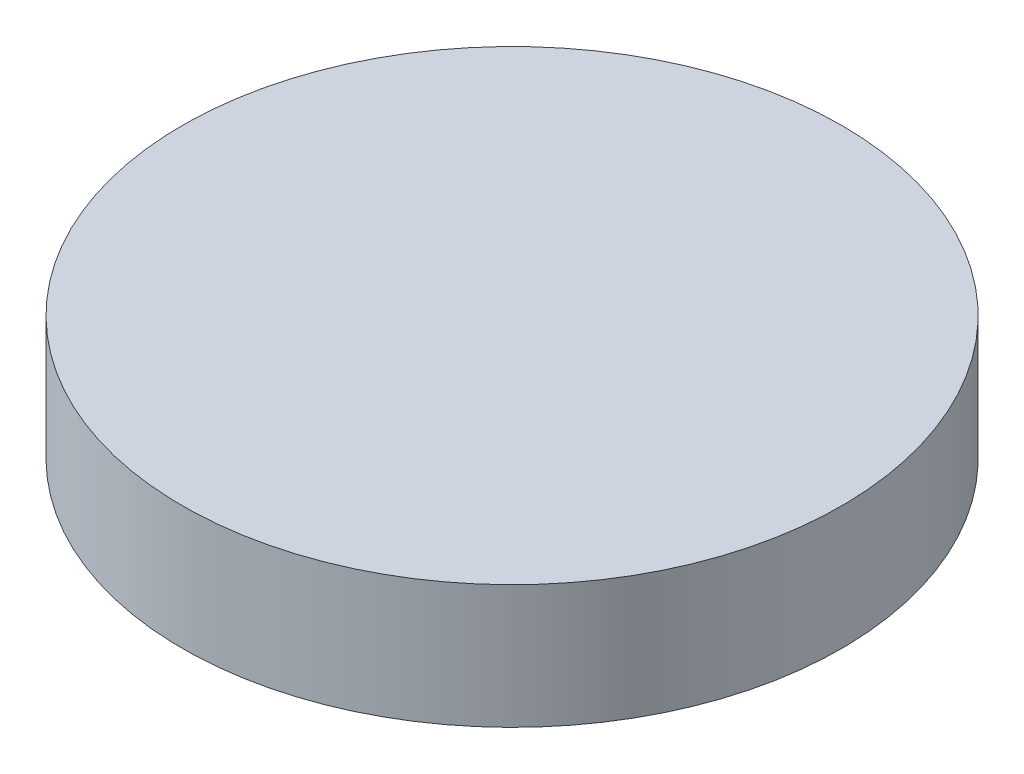
ISO-10303-21;
HEADER;
FILE_DESCRIPTION(('STEP AP214'),'2;1');
FILE_NAME('part.step','',(''),(''),'','','');
FILE_SCHEMA(('AUTOMOTIVE_DESIGN { 1 0 10303 214 1 1 1 1 }'));
ENDSEC;
DATA;
#1=APPLICATION_CONTEXT('core data for automotive mechanical design processes');
#2=APPLICATION_PROTOCOL_DEFINITION('international standard','automotive_design',2000,#1);
#3=PRODUCT_CONTEXT('',#1,'mechanical');
#4=PRODUCT('Part','Part','',(#3));
#5=PRODUCT_RELATED_PRODUCT_CATEGORY('part','',(#4));
#6=PRODUCT_DEFINITION_FORMATION('','',#4);
#7=PRODUCT_DEFINITION_CONTEXT('part definition',#1,'design');
#8=PRODUCT_DEFINITION('design','',#6,#7);
#9=PRODUCT_DEFINITION_SHAPE('','',#8);
#10=(LENGTH_UNIT() NAMED_UNIT(*) SI_UNIT(.MILLI.,.METRE.));
#11=(NAMED_UNIT(*) PLANE_ANGLE_UNIT() SI_UNIT($,.RADIAN.));
#12=(NAMED_UNIT(*) SI_UNIT($,.STERADIAN.) SOLID_ANGLE_UNIT());
#13=UNCERTAINTY_MEASURE_WITH_UNIT(LENGTH_MEASURE(1.E-05),#10,'distance_accuracy_value','');
#14=(GEOMETRIC_REPRESENTATION_CONTEXT(3) GLOBAL_UNCERTAINTY_ASSIGNED_CONTEXT((#13)) GLOBAL_UNIT_ASSIGNED_CONTEXT((#10,
#11,#12)) REPRESENTATION_CONTEXT('',''));
#15=CARTESIAN_POINT('',(0.,0.,0.));
#16=DIRECTION('',(0.,0.,1.));
#17=DIRECTION('',(1.,0.,0.));
#18=AXIS2_PLACEMENT_3D('',#15,#16,#17);
#19=CARTESIAN_POINT('',(0.,19.05,0.));
#20=DIRECTION('',(0.,-1.,0.));
#21=DIRECTION('',(0.,0.,-1.));
#22=AXIS2_PLACEMENT_3D('',#19,#20,#21);
#23=CYLINDRICAL_SURFACE('',#22,50.8);
#24=CARTESIAN_POINT('',(0.,19.05,0.));
#25=DIRECTION('',(0.,1.,0.));
#26=DIRECTION('',(0.,0.,1.));
#27=AXIS2_PLACEMENT_3D('',#24,#25,#26);
#28=CIRCLE('',#27,50.8);
#29=CARTESIAN_POINT('',(0.,19.05,-50.8));
#30=VERTEX_POINT('',#29);
#31=EDGE_CURVE('E10',#30,#30,#28,.T.);
#32=CARTESIAN_POINT('',(0.,0.,0.));
#33=DIRECTION('',(0.,1.,0.));
#34=DIRECTION('',(0.,0.,1.));
#35=AXIS2_PLACEMENT_3D('',#32,#33,#34);
#36=CIRCLE('',#35,50.8);
#37=CARTESIAN_POINT('',(0.,0.,-50.8));
#38=VERTEX_POINT('',#37);
#39=EDGE_CURVE('E40',#38,#38,#36,.T.);
#40=CARTESIAN_POINT('',(0.,19.05,-50.8));
#41=CARTESIAN_POINT('',(0.,18.8515625,-50.8));
#42=CARTESIAN_POINT('',(0.,18.653125,-50.8));
#43=CARTESIAN_POINT('',(0.,18.25625,-50.8));
#44=CARTESIAN_POINT('',(0.,18.0578125,-50.8));
#45=CARTESIAN_POINT('',(0.,17.6609375,-50.8));
#46=CARTESIAN_POINT('',(0.,17.4625,-50.8));
#47=CARTESIAN_POINT('',(0.,17.065625,-50.8));
#48=CARTESIAN_POINT('',(0.,16.8671875,-50.8));
#49=CARTESIAN_POINT('',(0.,16.4703125,-50.8));
#50=CARTESIAN_POINT('',(0.,16.271875,-50.8));
#51=CARTESIAN_POINT('',(0.,15.875,-50.8));
#52=CARTESIAN_POINT('',(0.,15.6765625,-50.8));
#53=CARTESIAN_POINT('',(0.,15.2796875,-50.8));
#54=CARTESIAN_POINT('',(0.,15.08125,-50.8));
#55=CARTESIAN_POINT('',(0.,14.684375,-50.8));
#56=CARTESIAN_POINT('',(0.,14.4859375,-50.8));
#57=CARTESIAN_POINT('',(0.,14.0890625,-50.8));
#58=CARTESIAN_POINT('',(0.,13.890625,-50.8));
#59=CARTESIAN_POINT('',(0.,13.49375,-50.8));
#60=CARTESIAN_POINT('',(0.,13.2953125,-50.8));
#61=CARTESIAN_POINT('',(0.,12.8984375,-50.8));
#62=CARTESIAN_POINT('',(0.,12.7,-50.8));
#63=CARTESIAN_POINT('',(0.,12.303125,-50.8));
#64=CARTESIAN_POINT('',(0.,12.1046875,-50.8));
#65=CARTESIAN_POINT('',(0.,11.7078125,-50.8));
#66=CARTESIAN_POINT('',(0.,11.509375,-50.8));
#67=CARTESIAN_POINT('',(0.,11.1125,-50.8));
#68=CARTESIAN_POINT('',(0.,10.9140625,-50.8));
#69=CARTESIAN_POINT('',(0.,10.5171875,-50.8));
#70=CARTESIAN_POINT('',(0.,10.31875,-50.8));
#71=CARTESIAN_POINT('',(0.,9.921875,-50.8));
#72=CARTESIAN_POINT('',(0.,9.7234375,-50.8));
#73=CARTESIAN_POINT('',(0.,9.3265625,-50.8));
#74=CARTESIAN_POINT('',(0.,9.128125,-50.8));
#75=CARTESIAN_POINT('',(0.,8.73125,-50.8));
#76=CARTESIAN_POINT('',(0.,8.5328125,-50.8));
#77=CARTESIAN_POINT('',(0.,8.1359375,-50.8));
#78=CARTESIAN_POINT('',(0.,7.9375,-50.8));
#79=CARTESIAN_POINT('',(0.,7.540625,-50.8));
#80=CARTESIAN_POINT('',(0.,7.3421875,-50.8));
#81=CARTESIAN_POINT('',(0.,6.9453125,-50.8));
#82=CARTESIAN_POINT('',(0.,6.746875,-50.8));
#83=CARTESIAN_POINT('',(0.,6.35,-50.8));
#84=CARTESIAN_POINT('',(0.,6.1515625,-50.8));
#85=CARTESIAN_POINT('',(0.,5.7546875,-50.8));
#86=CARTESIAN_POINT('',(0.,5.55625,-50.8));
#87=CARTESIAN_POINT('',(0.,5.159375,-50.8));
#88=CARTESIAN_POINT('',(0.,4.9609375,-50.8));
#89=CARTESIAN_POINT('',(0.,4.5640625,-50.8));
#90=CARTESIAN_POINT('',(0.,4.365625,-50.8));
#91=CARTESIAN_POINT('',(0.,3.96875,-50.8));
#92=CARTESIAN_POINT('',(0.,3.7703125,-50.8));
#93=CARTESIAN_POINT('',(0.,3.3734375,-50.8));
#94=CARTESIAN_POINT('',(0.,3.175,-50.8));
#95=CARTESIAN_POINT('',(0.,2.778125,-50.8));
#96=CARTESIAN_POINT('',(0.,2.5796875,-50.8));
#97=CARTESIAN_POINT('',(0.,2.1828125,-50.8));
#98=CARTESIAN_POINT('',(0.,1.984375,-50.8));
#99=CARTESIAN_POINT('',(0.,1.5875,-50.8));
#100=CARTESIAN_POINT('',(0.,1.3890625,-50.8));
#101=CARTESIAN_POINT('',(0.,0.992187500000001,-50.8));
#102=CARTESIAN_POINT('',(0.,0.793750000000001,-50.8));
#103=CARTESIAN_POINT('',(0.,0.396875,-50.8));
#104=CARTESIAN_POINT('',(0.,0.1984375,-50.8));
#105=CARTESIAN_POINT('',(0.,0.,-50.8));
#106=B_SPLINE_CURVE_WITH_KNOTS('',3,(#40,#41,#42,#43,#44,#45,#46,#47,#48,#49,#50,#51,#52,#53,
#54,#55,#56,#57,#58,#59,#60,#61,#62,#63,#64,#65,#66,#67,#68,#69,#70,#71,#72,#73,#74,#75,#76,#77,
#78,#79,#80,#81,#82,#83,#84,#85,#86,#87,#88,#89,#90,#91,#92,#93,#94,#95,#96,#97,#98,#99,#100,
#101,#102,#103,#104,#105),.UNSPECIFIED.,.F.,.F.,(4,2,2,2,2,2,2,2,2,2,2,2,2,2,2,2,2,2,2,2,2,2,2,
2,2,2,2,2,2,2,2,2,4),(0.,0.595312499999997,1.190625,1.7859375,2.38125,2.9765625,3.571875,
4.1671875,4.7625,5.3578125,5.953125,6.5484375,7.14375,7.7390625,8.334375,8.9296875,9.525,
10.1203125,10.715625,11.3109375,11.90625,12.5015625,13.096875,13.6921875,14.2875,14.8828125,
15.478125,16.0734375,16.66875,17.2640625,17.859375,18.4546875,19.05),.UNSPECIFIED.);
#107=EDGE_CURVE('BSEAM37',#30,#38,#106,.T.);
#108=ORIENTED_EDGE('',*,*,#31,.F.);
#109=ORIENTED_EDGE('',*,*,#39,.T.);
#110=ORIENTED_EDGE('',*,*,#107,.T.);
#111=ORIENTED_EDGE('',*,*,#107,.F.);
#112=EDGE_LOOP('',(#108,#110,#109,#111));
#113=FACE_BOUND('',#112,.T.);
#114=ADVANCED_FACE('F37',(#113),#23,.T.);
#115=CARTESIAN_POINT('',(0.,19.05,0.));
#116=DIRECTION('',(0.,1.,0.));
#117=DIRECTION('',(0.,0.,1.));
#118=AXIS2_PLACEMENT_3D('',#115,#116,#117);
#119=PLANE('',#118);
#120=ORIENTED_EDGE('',*,*,#31,.T.);
#121=EDGE_LOOP('',(#120));
#122=FACE_BOUND('',#121,.T.);
#123=ADVANCED_FACE('F54',(#122),#119,.T.);
#124=CARTESIAN_POINT('',(0.,0.,0.));
#125=DIRECTION('',(0.,1.,0.));
#126=DIRECTION('',(0.,0.,1.));
#127=AXIS2_PLACEMENT_3D('',#124,#125,#126);
#128=PLANE('',#127);
#129=ORIENTED_EDGE('',*,*,#39,.F.);
#130=EDGE_LOOP('',(#129));
#131=FACE_BOUND('',#130,.T.);
#132=ADVANCED_FACE('F52',(#131),#128,.F.);
#133=CLOSED_SHELL('',(#114,#123,#132));
#134=MANIFOLD_SOLID_BREP('B2',#133);
#135=ADVANCED_BREP_SHAPE_REPRESENTATION('',(#18,#134),#14);
#136=SHAPE_DEFINITION_REPRESENTATION(#9,#135);
ENDSEC;
END-ISO-10303-21;
